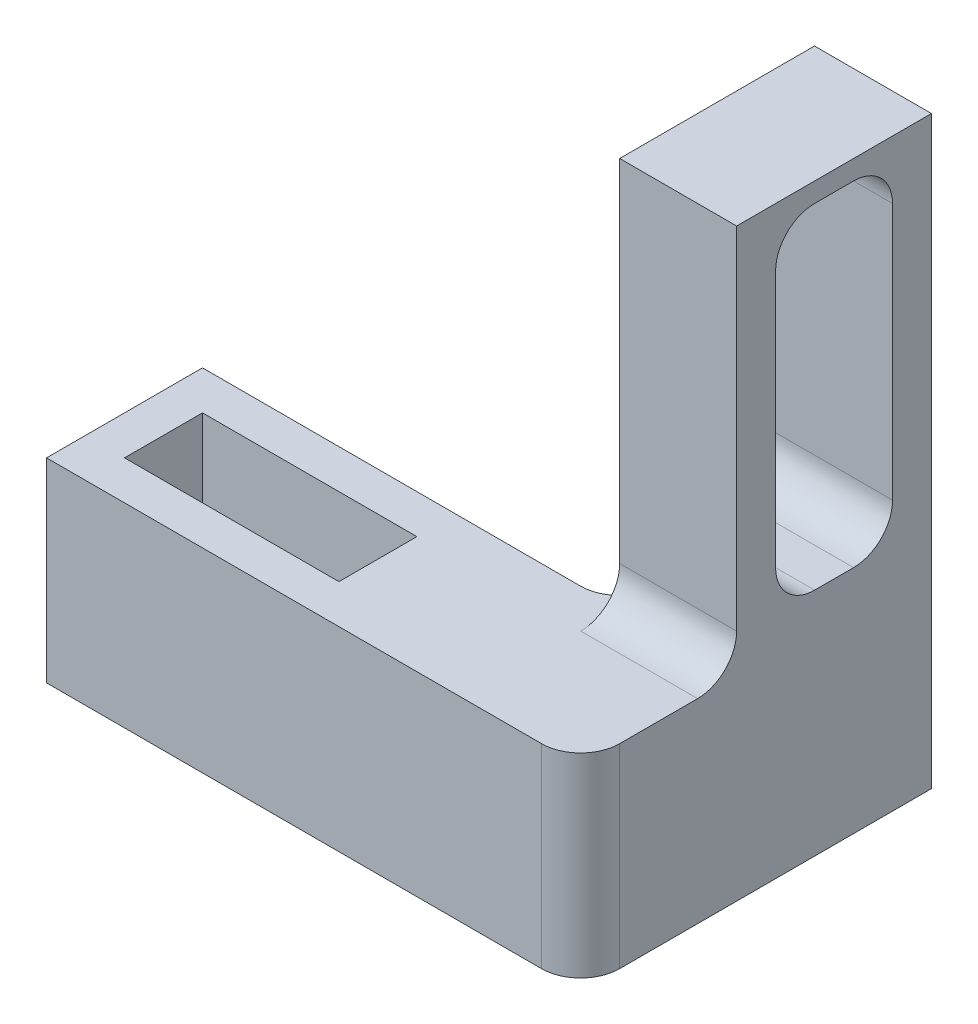
ISO-10303-21;
HEADER;
FILE_DESCRIPTION(('STEP AP214'),'2;1');
FILE_NAME('part.step','',(''),(''),'','','');
FILE_SCHEMA(('AUTOMOTIVE_DESIGN { 1 0 10303 214 1 1 1 1 }'));
ENDSEC;
DATA;
#1=APPLICATION_CONTEXT('core data for automotive mechanical design processes');
#2=APPLICATION_PROTOCOL_DEFINITION('international standard','automotive_design',2000,#1);
#3=PRODUCT_CONTEXT('',#1,'mechanical');
#4=PRODUCT('Part','Part','',(#3));
#5=PRODUCT_RELATED_PRODUCT_CATEGORY('part','',(#4));
#6=PRODUCT_DEFINITION_FORMATION('','',#4);
#7=PRODUCT_DEFINITION_CONTEXT('part definition',#1,'design');
#8=PRODUCT_DEFINITION('design','',#6,#7);
#9=PRODUCT_DEFINITION_SHAPE('','',#8);
#10=(LENGTH_UNIT() NAMED_UNIT(*) SI_UNIT(.MILLI.,.METRE.));
#11=(NAMED_UNIT(*) PLANE_ANGLE_UNIT() SI_UNIT($,.RADIAN.));
#12=(NAMED_UNIT(*) SI_UNIT($,.STERADIAN.) SOLID_ANGLE_UNIT());
#13=UNCERTAINTY_MEASURE_WITH_UNIT(LENGTH_MEASURE(1.E-05),#10,'distance_accuracy_value','');
#14=(GEOMETRIC_REPRESENTATION_CONTEXT(3) GLOBAL_UNCERTAINTY_ASSIGNED_CONTEXT((#13)) GLOBAL_UNIT_ASSIGNED_CONTEXT((#10,
#11,#12)) REPRESENTATION_CONTEXT('',''));
#15=CARTESIAN_POINT('',(0.,0.,0.));
#16=DIRECTION('',(0.,0.,1.));
#17=DIRECTION('',(1.,0.,0.));
#18=AXIS2_PLACEMENT_3D('',#15,#16,#17);
#19=CARTESIAN_POINT('',(-3.51352406652433,5.,-4.9069919410516));
#20=DIRECTION('',(0.,0.,1.));
#21=DIRECTION('',(1.,0.,0.));
#22=AXIS2_PLACEMENT_3D('',#19,#20,#21);
#23=PLANE('',#22);
#24=DIRECTION('',(0.,-1.,0.));
#25=VECTOR('',#24,1.);
#26=CARTESIAN_POINT('',(-3.51352406652433,5.,-4.9069919410516));
#27=LINE('',#26,#25);
#28=CARTESIAN_POINT('',(-3.51352406652433,5.,-4.9069919410516));
#29=VERTEX_POINT('',#28);
#30=CARTESIAN_POINT('',(-3.51352406652433,0.,-4.9069919410516));
#31=VERTEX_POINT('',#30);
#32=EDGE_CURVE('E270',#29,#31,#27,.T.);
#33=ORIENTED_EDGE('',*,*,#32,.F.);
#34=DIRECTION('',(1.,0.,0.));
#35=VECTOR('',#34,1.);
#36=CARTESIAN_POINT('',(-3.51352406652433,5.,-4.9069919410516));
#37=LINE('',#36,#35);
#38=CARTESIAN_POINT('',(6.18647593347567,5.,-4.9069919410516));
#39=VERTEX_POINT('',#38);
#40=EDGE_CURVE('E199',#29,#39,#37,.T.);
#41=ORIENTED_EDGE('',*,*,#40,.T.);
#42=DIRECTION('',(0.,1.,0.));
#43=VECTOR('',#42,1.);
#44=CARTESIAN_POINT('',(6.18647593347567,0.,-4.9069919410516));
#45=LINE('',#44,#43);
#46=CARTESIAN_POINT('',(6.18647593347567,0.,-4.9069919410516));
#47=VERTEX_POINT('',#46);
#48=EDGE_CURVE('E284',#39,#47,#45,.F.);
#49=ORIENTED_EDGE('',*,*,#48,.T.);
#50=DIRECTION('',(-1.,0.,0.));
#51=VECTOR('',#50,1.);
#52=CARTESIAN_POINT('',(-3.51352406652433,0.,-4.9069919410516));
#53=LINE('',#52,#51);
#54=EDGE_CURVE('E268',#47,#31,#53,.T.);
#55=ORIENTED_EDGE('',*,*,#54,.T.);
#56=EDGE_LOOP('',(#33,#41,#49,#55));
#57=FACE_BOUND('',#56,.T.);
#58=ADVANCED_FACE('F33',(#57),#23,.F.);
#59=CARTESIAN_POINT('',(0.,5.,0.));
#60=DIRECTION('',(0.,1.,0.));
#61=DIRECTION('',(0.,0.,1.));
#62=AXIS2_PLACEMENT_3D('',#59,#60,#61);
#63=PLANE('',#62);
#64=DIRECTION('',(1.,0.,0.));
#65=VECTOR('',#64,1.);
#66=CARTESIAN_POINT('',(-3.51352406652433,5.,-0.906991941051601));
#67=LINE('',#66,#65);
#68=CARTESIAN_POINT('',(-3.51352406652433,5.,-0.906991941051601));
#69=VERTEX_POINT('',#68);
#70=CARTESIAN_POINT('',(9.18647593347567,5.,-0.906991941051601));
#71=VERTEX_POINT('',#70);
#72=EDGE_CURVE('E267',#69,#71,#67,.T.);
#73=ORIENTED_EDGE('',*,*,#72,.T.);
#74=CARTESIAN_POINT('',(9.18647593347567,5.,-1.9069919410516));
#75=DIRECTION('',(0.,1.,0.));
#76=DIRECTION('',(0.,0.,1.));
#77=AXIS2_PLACEMENT_3D('',#74,#75,#76);
#78=CIRCLE('',#77,1.);
#79=CARTESIAN_POINT('',(10.1864759334757,5.,-1.9069919410516));
#80=VERTEX_POINT('',#79);
#81=EDGE_CURVE('E422',#71,#80,#78,.T.);
#82=ORIENTED_EDGE('',*,*,#81,.T.);
#83=DIRECTION('',(0.,0.,-1.));
#84=VECTOR('',#83,1.);
#85=CARTESIAN_POINT('',(10.1864759334757,5.,-0.906991941051601));
#86=LINE('',#85,#84);
#87=CARTESIAN_POINT('',(10.1864759334757,5.,-3.90941153273538));
#88=VERTEX_POINT('',#87);
#89=EDGE_CURVE('E214',#80,#88,#86,.T.);
#90=ORIENTED_EDGE('',*,*,#89,.T.);
#91=DIRECTION('',(1.,0.,0.));
#92=VECTOR('',#91,1.);
#93=CARTESIAN_POINT('',(0.,5.,-3.90941153273538));
#94=LINE('',#93,#92);
#95=CARTESIAN_POINT('',(7.18647593347567,5.,-3.90941153273538));
#96=VERTEX_POINT('',#95);
#97=EDGE_CURVE('E206',#88,#96,#94,.F.);
#98=ORIENTED_EDGE('',*,*,#97,.T.);
#99=DIRECTION('',(0.,0.,-1.));
#100=VECTOR('',#99,1.);
#101=CARTESIAN_POINT('',(7.18647593347567,5.,-5.9069919410516));
#102=LINE('',#101,#100);
#103=CARTESIAN_POINT('',(7.18647593347567,5.,-5.9069919410516));
#104=VERTEX_POINT('',#103);
#105=EDGE_CURVE('E187',#96,#104,#102,.T.);
#106=ORIENTED_EDGE('',*,*,#105,.T.);
#107=CARTESIAN_POINT('',(6.18647593347567,5.,-5.9069919410516));
#108=DIRECTION('',(0.,-1.,0.));
#109=DIRECTION('',(0.,0.,-1.));
#110=AXIS2_PLACEMENT_3D('',#107,#108,#109);
#111=CIRCLE('',#110,1.);
#112=EDGE_CURVE('E288',#39,#104,#111,.F.);
#113=ORIENTED_EDGE('',*,*,#112,.F.);
#114=ORIENTED_EDGE('',*,*,#40,.F.);
#115=DIRECTION('',(0.,0.,1.));
#116=VECTOR('',#115,1.);
#117=CARTESIAN_POINT('',(-3.51352406652433,5.,-4.9069919410516));
#118=LINE('',#117,#116);
#119=EDGE_CURVE('E265',#29,#69,#118,.T.);
#120=ORIENTED_EDGE('',*,*,#119,.T.);
#121=EDGE_LOOP('',(#73,#82,#90,#98,#106,#113,#114,#120));
#122=FACE_BOUND('',#121,.T.);
#123=DIRECTION('',(1.,0.,0.));
#124=VECTOR('',#123,1.);
#125=CARTESIAN_POINT('',(-2.51352406652433,5.,-1.9069919410516));
#126=LINE('',#125,#124);
#127=CARTESIAN_POINT('',(-2.51352406652433,5.,-1.9069919410516));
#128=VERTEX_POINT('',#127);
#129=CARTESIAN_POINT('',(2.98647593347567,5.,-1.9069919410516));
#130=VERTEX_POINT('',#129);
#131=EDGE_CURVE('E235',#128,#130,#126,.T.);
#132=ORIENTED_EDGE('',*,*,#131,.F.);
#133=DIRECTION('',(0.,0.,1.));
#134=VECTOR('',#133,1.);
#135=CARTESIAN_POINT('',(-2.51352406652433,5.,-3.9069919410516));
#136=LINE('',#135,#134);
#137=CARTESIAN_POINT('',(-2.51352406652433,5.,-3.9069919410516));
#138=VERTEX_POINT('',#137);
#139=EDGE_CURVE('E233',#138,#128,#136,.T.);
#140=ORIENTED_EDGE('',*,*,#139,.F.);
#141=DIRECTION('',(-1.,0.,0.));
#142=VECTOR('',#141,1.);
#143=CARTESIAN_POINT('',(-2.51352406652433,5.,-3.9069919410516));
#144=LINE('',#143,#142);
#145=CARTESIAN_POINT('',(2.98647593347567,5.,-3.9069919410516));
#146=VERTEX_POINT('',#145);
#147=EDGE_CURVE('E241',#146,#138,#144,.T.);
#148=ORIENTED_EDGE('',*,*,#147,.F.);
#149=DIRECTION('',(0.,0.,-1.));
#150=VECTOR('',#149,1.);
#151=CARTESIAN_POINT('',(2.98647593347567,5.,-3.9069919410516));
#152=LINE('',#151,#150);
#153=EDGE_CURVE('E238',#130,#146,#152,.T.);
#154=ORIENTED_EDGE('',*,*,#153,.F.);
#155=EDGE_LOOP('',(#132,#140,#148,#154));
#156=FACE_BOUND('',#155,.T.);
#157=ADVANCED_FACE('F211',(#122,#156),#63,.T.);
#158=CARTESIAN_POINT('',(0.,0.,0.));
#159=DIRECTION('',(0.,1.,0.));
#160=DIRECTION('',(0.,0.,1.));
#161=AXIS2_PLACEMENT_3D('',#158,#159,#160);
#162=PLANE('',#161);
#163=DIRECTION('',(0.,0.,-1.));
#164=VECTOR('',#163,1.);
#165=CARTESIAN_POINT('',(10.1864759334757,0.,-0.906991941051601));
#166=LINE('',#165,#164);
#167=CARTESIAN_POINT('',(10.1864759334757,0.,-1.9069919410516));
#168=VERTEX_POINT('',#167);
#169=CARTESIAN_POINT('',(10.1864759334757,0.,-9.9069919410516));
#170=VERTEX_POINT('',#169);
#171=EDGE_CURVE('E226',#168,#170,#166,.T.);
#172=ORIENTED_EDGE('',*,*,#171,.F.);
#173=CARTESIAN_POINT('',(9.18647593347567,0.,-1.9069919410516));
#174=DIRECTION('',(0.,1.,0.));
#175=DIRECTION('',(0.,0.,1.));
#176=AXIS2_PLACEMENT_3D('',#173,#174,#175);
#177=CIRCLE('',#176,1.);
#178=CARTESIAN_POINT('',(9.18647593347567,0.,-0.906991941051601));
#179=VERTEX_POINT('',#178);
#180=EDGE_CURVE('E427',#168,#179,#177,.F.);
#181=ORIENTED_EDGE('',*,*,#180,.T.);
#182=DIRECTION('',(1.,0.,0.));
#183=VECTOR('',#182,1.);
#184=CARTESIAN_POINT('',(-3.51352406652433,0.,-0.906991941051601));
#185=LINE('',#184,#183);
#186=CARTESIAN_POINT('',(-3.51352406652433,0.,-0.906991941051601));
#187=VERTEX_POINT('',#186);
#188=EDGE_CURVE('E273',#187,#179,#185,.T.);
#189=ORIENTED_EDGE('',*,*,#188,.F.);
#190=DIRECTION('',(0.,0.,1.));
#191=VECTOR('',#190,1.);
#192=CARTESIAN_POINT('',(-3.51352406652433,0.,-4.9069919410516));
#193=LINE('',#192,#191);
#194=EDGE_CURVE('E264',#31,#187,#193,.T.);
#195=ORIENTED_EDGE('',*,*,#194,.F.);
#196=ORIENTED_EDGE('',*,*,#54,.F.);
#197=CARTESIAN_POINT('',(6.18647593347567,0.,-5.9069919410516));
#198=DIRECTION('',(0.,1.,0.));
#199=DIRECTION('',(0.,0.,1.));
#200=AXIS2_PLACEMENT_3D('',#197,#198,#199);
#201=CIRCLE('',#200,1.);
#202=CARTESIAN_POINT('',(7.18647593347567,0.,-5.9069919410516));
#203=VERTEX_POINT('',#202);
#204=EDGE_CURVE('E286',#47,#203,#201,.T.);
#205=ORIENTED_EDGE('',*,*,#204,.T.);
#206=DIRECTION('',(0.,0.,1.));
#207=VECTOR('',#206,1.);
#208=CARTESIAN_POINT('',(7.18647593347567,0.,-9.9069919410516));
#209=LINE('',#208,#207);
#210=CARTESIAN_POINT('',(7.18647593347567,0.,-9.9069919410516));
#211=VERTEX_POINT('',#210);
#212=EDGE_CURVE('E227',#211,#203,#209,.T.);
#213=ORIENTED_EDGE('',*,*,#212,.F.);
#214=DIRECTION('',(-1.,0.,0.));
#215=VECTOR('',#214,1.);
#216=CARTESIAN_POINT('',(10.1864759334757,0.,-9.9069919410516));
#217=LINE('',#216,#215);
#218=EDGE_CURVE('E358',#170,#211,#217,.T.);
#219=ORIENTED_EDGE('',*,*,#218,.F.);
#220=EDGE_LOOP('',(#172,#181,#189,#195,#196,#205,#213,#219));
#221=FACE_BOUND('',#220,.T.);
#222=DIRECTION('',(0.,0.,1.));
#223=VECTOR('',#222,1.);
#224=CARTESIAN_POINT('',(-2.51352406652433,0.,-3.9069919410516));
#225=LINE('',#224,#223);
#226=CARTESIAN_POINT('',(-2.51352406652433,0.,-3.9069919410516));
#227=VERTEX_POINT('',#226);
#228=CARTESIAN_POINT('',(-2.51352406652433,0.,-1.9069919410516));
#229=VERTEX_POINT('',#228);
#230=EDGE_CURVE('E244',#227,#229,#225,.T.);
#231=ORIENTED_EDGE('',*,*,#230,.T.);
#232=DIRECTION('',(1.,0.,0.));
#233=VECTOR('',#232,1.);
#234=CARTESIAN_POINT('',(-2.51352406652433,0.,-1.9069919410516));
#235=LINE('',#234,#233);
#236=CARTESIAN_POINT('',(2.98647593347567,0.,-1.9069919410516));
#237=VERTEX_POINT('',#236);
#238=EDGE_CURVE('E247',#229,#237,#235,.T.);
#239=ORIENTED_EDGE('',*,*,#238,.T.);
#240=DIRECTION('',(0.,0.,-1.));
#241=VECTOR('',#240,1.);
#242=CARTESIAN_POINT('',(2.98647593347567,0.,-3.9069919410516));
#243=LINE('',#242,#241);
#244=CARTESIAN_POINT('',(2.98647593347567,0.,-3.9069919410516));
#245=VERTEX_POINT('',#244);
#246=EDGE_CURVE('E250',#237,#245,#243,.T.);
#247=ORIENTED_EDGE('',*,*,#246,.T.);
#248=DIRECTION('',(-1.,0.,0.));
#249=VECTOR('',#248,1.);
#250=CARTESIAN_POINT('',(-2.51352406652433,0.,-3.9069919410516));
#251=LINE('',#250,#249);
#252=EDGE_CURVE('E236',#245,#227,#251,.T.);
#253=ORIENTED_EDGE('',*,*,#252,.T.);
#254=EDGE_LOOP('',(#231,#239,#247,#253));
#255=FACE_BOUND('',#254,.T.);
#256=ADVANCED_FACE('F408',(#221,#255),#162,.F.);
#257=CARTESIAN_POINT('',(-3.51352406652433,5.,-4.9069919410516));
#258=DIRECTION('',(1.,0.,0.));
#259=DIRECTION('',(0.,0.,-1.));
#260=AXIS2_PLACEMENT_3D('',#257,#258,#259);
#261=PLANE('',#260);
#262=ORIENTED_EDGE('',*,*,#119,.F.);
#263=ORIENTED_EDGE('',*,*,#32,.T.);
#264=ORIENTED_EDGE('',*,*,#194,.T.);
#265=DIRECTION('',(0.,-1.,0.));
#266=VECTOR('',#265,1.);
#267=CARTESIAN_POINT('',(-3.51352406652433,5.,-0.906991941051601));
#268=LINE('',#267,#266);
#269=EDGE_CURVE('E366',#69,#187,#268,.T.);
#270=ORIENTED_EDGE('',*,*,#269,.F.);
#271=EDGE_LOOP('',(#262,#263,#264,#270));
#272=FACE_BOUND('',#271,.T.);
#273=ADVANCED_FACE('F415',(#272),#261,.F.);
#274=CARTESIAN_POINT('',(-3.51352406652433,5.,-0.906991941051601));
#275=DIRECTION('',(0.,0.,-1.));
#276=DIRECTION('',(-1.,0.,0.));
#277=AXIS2_PLACEMENT_3D('',#274,#275,#276);
#278=PLANE('',#277);
#279=ORIENTED_EDGE('',*,*,#188,.T.);
#280=DIRECTION('',(0.,-1.,0.));
#281=VECTOR('',#280,1.);
#282=CARTESIAN_POINT('',(9.18647593347567,5.,-0.906991941051601));
#283=LINE('',#282,#281);
#284=EDGE_CURVE('E420',#179,#71,#283,.F.);
#285=ORIENTED_EDGE('',*,*,#284,.T.);
#286=ORIENTED_EDGE('',*,*,#72,.F.);
#287=ORIENTED_EDGE('',*,*,#269,.T.);
#288=EDGE_LOOP('',(#279,#285,#286,#287));
#289=FACE_BOUND('',#288,.T.);
#290=ADVANCED_FACE('F418',(#289),#278,.F.);
#291=CARTESIAN_POINT('',(-2.51352406652433,5.,-3.9069919410516));
#292=DIRECTION('',(1.,0.,0.));
#293=DIRECTION('',(0.,0.,-1.));
#294=AXIS2_PLACEMENT_3D('',#291,#292,#293);
#295=PLANE('',#294);
#296=ORIENTED_EDGE('',*,*,#230,.F.);
#297=DIRECTION('',(0.,-1.,0.));
#298=VECTOR('',#297,1.);
#299=CARTESIAN_POINT('',(-2.51352406652433,5.,-3.9069919410516));
#300=LINE('',#299,#298);
#301=EDGE_CURVE('E243',#138,#227,#300,.T.);
#302=ORIENTED_EDGE('',*,*,#301,.F.);
#303=ORIENTED_EDGE('',*,*,#139,.T.);
#304=DIRECTION('',(0.,-1.,0.));
#305=VECTOR('',#304,1.);
#306=CARTESIAN_POINT('',(-2.51352406652433,5.,-1.9069919410516));
#307=LINE('',#306,#305);
#308=EDGE_CURVE('E261',#128,#229,#307,.T.);
#309=ORIENTED_EDGE('',*,*,#308,.T.);
#310=EDGE_LOOP('',(#296,#302,#303,#309));
#311=FACE_BOUND('',#310,.T.);
#312=ADVANCED_FACE('F456',(#311),#295,.T.);
#313=CARTESIAN_POINT('',(-2.51352406652433,5.,-1.9069919410516));
#314=DIRECTION('',(0.,0.,-1.));
#315=DIRECTION('',(-1.,0.,0.));
#316=AXIS2_PLACEMENT_3D('',#313,#314,#315);
#317=PLANE('',#316);
#318=ORIENTED_EDGE('',*,*,#238,.F.);
#319=ORIENTED_EDGE('',*,*,#308,.F.);
#320=ORIENTED_EDGE('',*,*,#131,.T.);
#321=DIRECTION('',(0.,-1.,0.));
#322=VECTOR('',#321,1.);
#323=CARTESIAN_POINT('',(2.98647593347567,5.,-1.9069919410516));
#324=LINE('',#323,#322);
#325=EDGE_CURVE('E259',#130,#237,#324,.T.);
#326=ORIENTED_EDGE('',*,*,#325,.T.);
#327=EDGE_LOOP('',(#318,#319,#320,#326));
#328=FACE_BOUND('',#327,.T.);
#329=ADVANCED_FACE('F604',(#328),#317,.T.);
#330=CARTESIAN_POINT('',(2.98647593347567,5.,-3.9069919410516));
#331=DIRECTION('',(-1.,0.,0.));
#332=DIRECTION('',(0.,0.,1.));
#333=AXIS2_PLACEMENT_3D('',#330,#331,#332);
#334=PLANE('',#333);
#335=ORIENTED_EDGE('',*,*,#246,.F.);
#336=ORIENTED_EDGE('',*,*,#325,.F.);
#337=ORIENTED_EDGE('',*,*,#153,.T.);
#338=DIRECTION('',(0.,-1.,0.));
#339=VECTOR('',#338,1.);
#340=CARTESIAN_POINT('',(2.98647593347567,5.,-3.9069919410516));
#341=LINE('',#340,#339);
#342=EDGE_CURVE('E257',#146,#245,#341,.T.);
#343=ORIENTED_EDGE('',*,*,#342,.T.);
#344=EDGE_LOOP('',(#335,#336,#337,#343));
#345=FACE_BOUND('',#344,.T.);
#346=ADVANCED_FACE('F612',(#345),#334,.T.);
#347=CARTESIAN_POINT('',(-2.51352406652433,5.,-3.9069919410516));
#348=DIRECTION('',(0.,0.,1.));
#349=DIRECTION('',(1.,0.,0.));
#350=AXIS2_PLACEMENT_3D('',#347,#348,#349);
#351=PLANE('',#350);
#352=ORIENTED_EDGE('',*,*,#252,.F.);
#353=ORIENTED_EDGE('',*,*,#342,.F.);
#354=ORIENTED_EDGE('',*,*,#147,.T.);
#355=ORIENTED_EDGE('',*,*,#301,.T.);
#356=EDGE_LOOP('',(#352,#353,#354,#355));
#357=FACE_BOUND('',#356,.T.);
#358=ADVANCED_FACE('F620',(#357),#351,.T.);
#359=CARTESIAN_POINT('',(10.1864759334757,5.,-0.906991941051601));
#360=DIRECTION('',(1.,0.,0.));
#361=DIRECTION('',(0.,0.,-1.));
#362=AXIS2_PLACEMENT_3D('',#359,#360,#361);
#363=PLANE('',#362);
#364=DIRECTION('',(0.,-1.,0.));
#365=VECTOR('',#364,1.);
#366=CARTESIAN_POINT('',(10.1864759334757,14.5,-5.90941153273538));
#367=LINE('',#366,#365);
#368=CARTESIAN_POINT('',(10.1864759334757,13.5,-5.90941153273538));
#369=VERTEX_POINT('',#368);
#370=CARTESIAN_POINT('',(10.1864759334757,6.91005895147456,-5.90941153273538));
#371=VERTEX_POINT('',#370);
#372=EDGE_CURVE('E386',#369,#371,#367,.T.);
#373=ORIENTED_EDGE('',*,*,#372,.F.);
#374=CARTESIAN_POINT('',(10.1864759334757,13.5,-6.90941153273538));
#375=DIRECTION('',(1.,0.,0.));
#376=DIRECTION('',(0.,0.,-1.));
#377=AXIS2_PLACEMENT_3D('',#374,#375,#376);
#378=CIRCLE('',#377,1.);
#379=CARTESIAN_POINT('',(10.1864759334757,14.5,-6.90941153273538));
#380=VERTEX_POINT('',#379);
#381=EDGE_CURVE('E318',#369,#380,#378,.F.);
#382=ORIENTED_EDGE('',*,*,#381,.T.);
#383=DIRECTION('',(0.,0.,1.));
#384=VECTOR('',#383,1.);
#385=CARTESIAN_POINT('',(10.1864759334757,14.5,-5.90941153273538));
#386=LINE('',#385,#384);
#387=CARTESIAN_POINT('',(10.1864759334757,14.5,-7.90941153273538));
#388=VERTEX_POINT('',#387);
#389=EDGE_CURVE('E330',#388,#380,#386,.T.);
#390=ORIENTED_EDGE('',*,*,#389,.F.);
#391=CARTESIAN_POINT('',(10.1864759334757,13.5,-7.90941153273538));
#392=DIRECTION('',(1.,0.,0.));
#393=DIRECTION('',(0.,0.,-1.));
#394=AXIS2_PLACEMENT_3D('',#391,#392,#393);
#395=CIRCLE('',#394,1.);
#396=CARTESIAN_POINT('',(10.1864759334757,13.5,-8.90941153273538));
#397=VERTEX_POINT('',#396);
#398=EDGE_CURVE('E41',#388,#397,#395,.F.);
#399=ORIENTED_EDGE('',*,*,#398,.T.);
#400=DIRECTION('',(0.,1.,0.));
#401=VECTOR('',#400,1.);
#402=CARTESIAN_POINT('',(10.1864759334757,14.5,-8.90941153273538));
#403=LINE('',#402,#401);
#404=CARTESIAN_POINT('',(10.1864759334757,6.91005895147456,-8.90941153273538));
#405=VERTEX_POINT('',#404);
#406=EDGE_CURVE('E339',#405,#397,#403,.T.);
#407=ORIENTED_EDGE('',*,*,#406,.F.);
#408=CARTESIAN_POINT('',(10.1864759334757,6.91005895147456,-7.90941153273538));
#409=DIRECTION('',(1.,0.,0.));
#410=DIRECTION('',(0.,0.,-1.));
#411=AXIS2_PLACEMENT_3D('',#408,#409,#410);
#412=CIRCLE('',#411,1.);
#413=CARTESIAN_POINT('',(10.1864759334757,5.91005895147456,-7.90941153273538));
#414=VERTEX_POINT('',#413);
#415=EDGE_CURVE('E296',#405,#414,#412,.F.);
#416=ORIENTED_EDGE('',*,*,#415,.T.);
#417=DIRECTION('',(0.,0.,-1.));
#418=VECTOR('',#417,1.);
#419=CARTESIAN_POINT('',(10.1864759334757,5.91005895147456,-5.90941153273538));
#420=LINE('',#419,#418);
#421=CARTESIAN_POINT('',(10.1864759334757,5.91005895147456,-6.90941153273538));
#422=VERTEX_POINT('',#421);
#423=EDGE_CURVE('E343',#422,#414,#420,.T.);
#424=ORIENTED_EDGE('',*,*,#423,.F.);
#425=CARTESIAN_POINT('',(10.1864759334757,6.91005895147456,-6.90941153273538));
#426=DIRECTION('',(1.,0.,0.));
#427=DIRECTION('',(0.,0.,-1.));
#428=AXIS2_PLACEMENT_3D('',#425,#426,#427);
#429=CIRCLE('',#428,1.);
#430=EDGE_CURVE('E307',#422,#371,#429,.F.);
#431=ORIENTED_EDGE('',*,*,#430,.T.);
#432=EDGE_LOOP('',(#373,#382,#390,#399,#407,#416,#424,#431));
#433=FACE_BOUND('',#432,.T.);
#434=ORIENTED_EDGE('',*,*,#89,.F.);
#435=DIRECTION('',(0.,-1.,0.));
#436=VECTOR('',#435,1.);
#437=CARTESIAN_POINT('',(10.1864759334757,0.,-1.9069919410516));
#438=LINE('',#437,#436);
#439=EDGE_CURVE('E218',#80,#168,#438,.T.);
#440=ORIENTED_EDGE('',*,*,#439,.T.);
#441=ORIENTED_EDGE('',*,*,#171,.T.);
#442=DIRECTION('',(0.,-1.,0.));
#443=VECTOR('',#442,1.);
#444=CARTESIAN_POINT('',(10.1864759334757,5.,-9.9069919410516));
#445=LINE('',#444,#443);
#446=CARTESIAN_POINT('',(10.1864759334757,15.,-9.9069919410516));
#447=VERTEX_POINT('',#446);
#448=EDGE_CURVE('E355',#447,#170,#445,.T.);
#449=ORIENTED_EDGE('',*,*,#448,.F.);
#450=DIRECTION('',(0.,0.,-1.));
#451=VECTOR('',#450,1.);
#452=CARTESIAN_POINT('',(10.1864759334757,15.,-9.9069919410516));
#453=LINE('',#452,#451);
#454=CARTESIAN_POINT('',(10.1864759334757,15.,-4.90941153273538));
#455=VERTEX_POINT('',#454);
#456=EDGE_CURVE('E348',#455,#447,#453,.T.);
#457=ORIENTED_EDGE('',*,*,#456,.F.);
#458=DIRECTION('',(0.,-1.,0.));
#459=VECTOR('',#458,1.);
#460=CARTESIAN_POINT('',(10.1864759334757,15.,-4.90941153273538));
#461=LINE('',#460,#459);
#462=CARTESIAN_POINT('',(10.1864759334757,6.,-4.90941153273538));
#463=VERTEX_POINT('',#462);
#464=EDGE_CURVE('E354',#455,#463,#461,.T.);
#465=ORIENTED_EDGE('',*,*,#464,.T.);
#466=CARTESIAN_POINT('',(10.1864759334757,6.,-3.90941153273538));
#467=DIRECTION('',(1.,0.,0.));
#468=DIRECTION('',(0.,0.,-1.));
#469=AXIS2_PLACEMENT_3D('',#466,#467,#468);
#470=CIRCLE('',#469,1.);
#471=EDGE_CURVE('E216',#463,#88,#470,.F.);
#472=ORIENTED_EDGE('',*,*,#471,.T.);
#473=EDGE_LOOP('',(#434,#440,#441,#449,#457,#465,#472));
#474=FACE_BOUND('',#473,.T.);
#475=ADVANCED_FACE('F335',(#433,#474),#363,.T.);
#476=CARTESIAN_POINT('',(7.18647593347567,5.,-9.9069919410516));
#477=DIRECTION('',(1.,0.,0.));
#478=DIRECTION('',(0.,1.,0.));
#479=AXIS2_PLACEMENT_3D('',#476,#477,#478);
#480=PLANE('',#479);
#481=DIRECTION('',(0.,1.,0.));
#482=VECTOR('',#481,1.);
#483=CARTESIAN_POINT('',(7.18647593347567,5.,-8.90941153273538));
#484=LINE('',#483,#482);
#485=CARTESIAN_POINT('',(7.18647593347567,6.91005895147456,-8.90941153273538));
#486=VERTEX_POINT('',#485);
#487=CARTESIAN_POINT('',(7.18647593347567,13.5,-8.90941153273538));
#488=VERTEX_POINT('',#487);
#489=EDGE_CURVE('E375',#486,#488,#484,.T.);
#490=ORIENTED_EDGE('',*,*,#489,.T.);
#491=CARTESIAN_POINT('',(7.18647593347567,13.5,-7.90941153273538));
#492=DIRECTION('',(1.,0.,0.));
#493=DIRECTION('',(0.,1.,0.));
#494=AXIS2_PLACEMENT_3D('',#491,#492,#493);
#495=CIRCLE('',#494,1.);
#496=CARTESIAN_POINT('',(7.18647593347567,14.5,-7.90941153273538));
#497=VERTEX_POINT('',#496);
#498=EDGE_CURVE('E11',#488,#497,#495,.T.);
#499=ORIENTED_EDGE('',*,*,#498,.T.);
#500=DIRECTION('',(0.,0.,1.));
#501=VECTOR('',#500,1.);
#502=CARTESIAN_POINT('',(7.18647593347567,14.5,-9.9069919410516));
#503=LINE('',#502,#501);
#504=CARTESIAN_POINT('',(7.18647593347567,14.5,-6.90941153273538));
#505=VERTEX_POINT('',#504);
#506=EDGE_CURVE('E331',#497,#505,#503,.T.);
#507=ORIENTED_EDGE('',*,*,#506,.T.);
#508=CARTESIAN_POINT('',(7.18647593347567,13.5,-6.90941153273538));
#509=DIRECTION('',(1.,0.,0.));
#510=DIRECTION('',(0.,1.,0.));
#511=AXIS2_PLACEMENT_3D('',#508,#509,#510);
#512=CIRCLE('',#511,1.);
#513=CARTESIAN_POINT('',(7.18647593347567,13.5,-5.90941153273538));
#514=VERTEX_POINT('',#513);
#515=EDGE_CURVE('E321',#505,#514,#512,.T.);
#516=ORIENTED_EDGE('',*,*,#515,.T.);
#517=DIRECTION('',(0.,-1.,0.));
#518=VECTOR('',#517,1.);
#519=CARTESIAN_POINT('',(7.18647593347567,5.,-5.90941153273538));
#520=LINE('',#519,#518);
#521=CARTESIAN_POINT('',(7.18647593347567,6.91005895147456,-5.90941153273538));
#522=VERTEX_POINT('',#521);
#523=EDGE_CURVE('E220',#514,#522,#520,.T.);
#524=ORIENTED_EDGE('',*,*,#523,.T.);
#525=CARTESIAN_POINT('',(7.18647593347567,6.91005895147456,-6.90941153273538));
#526=DIRECTION('',(1.,0.,0.));
#527=DIRECTION('',(0.,1.,0.));
#528=AXIS2_PLACEMENT_3D('',#525,#526,#527);
#529=CIRCLE('',#528,1.);
#530=CARTESIAN_POINT('',(7.18647593347567,5.91005895147456,-6.90941153273538));
#531=VERTEX_POINT('',#530);
#532=EDGE_CURVE('E310',#522,#531,#529,.T.);
#533=ORIENTED_EDGE('',*,*,#532,.T.);
#534=DIRECTION('',(0.,0.,-1.));
#535=VECTOR('',#534,1.);
#536=CARTESIAN_POINT('',(7.18647593347567,5.91005895147456,-9.9069919410516));
#537=LINE('',#536,#535);
#538=CARTESIAN_POINT('',(7.18647593347567,5.91005895147456,-7.90941153273538));
#539=VERTEX_POINT('',#538);
#540=EDGE_CURVE('E373',#531,#539,#537,.T.);
#541=ORIENTED_EDGE('',*,*,#540,.T.);
#542=CARTESIAN_POINT('',(7.18647593347567,6.91005895147456,-7.90941153273538));
#543=DIRECTION('',(1.,0.,0.));
#544=DIRECTION('',(0.,1.,0.));
#545=AXIS2_PLACEMENT_3D('',#542,#543,#544);
#546=CIRCLE('',#545,1.);
#547=EDGE_CURVE('E299',#539,#486,#546,.T.);
#548=ORIENTED_EDGE('',*,*,#547,.T.);
#549=EDGE_LOOP('',(#490,#499,#507,#516,#524,#533,#541,#548));
#550=FACE_BOUND('',#549,.T.);
#551=ORIENTED_EDGE('',*,*,#212,.T.);
#552=DIRECTION('',(0.,1.,0.));
#553=VECTOR('',#552,1.);
#554=CARTESIAN_POINT('',(7.18647593347567,5.93047785285145,-5.9069919410516));
#555=LINE('',#554,#553);
#556=EDGE_CURVE('E195',#203,#104,#555,.T.);
#557=ORIENTED_EDGE('',*,*,#556,.T.);
#558=ORIENTED_EDGE('',*,*,#105,.F.);
#559=CARTESIAN_POINT('',(7.18647593347567,6.,-3.90941153273538));
#560=DIRECTION('',(1.,0.,0.));
#561=DIRECTION('',(0.,0.,-1.));
#562=AXIS2_PLACEMENT_3D('',#559,#560,#561);
#563=CIRCLE('',#562,1.);
#564=CARTESIAN_POINT('',(7.18647593347567,6.,-4.90941153273538));
#565=VERTEX_POINT('',#564);
#566=EDGE_CURVE('E192',#565,#96,#563,.F.);
#567=ORIENTED_EDGE('',*,*,#566,.F.);
#568=DIRECTION('',(0.,-1.,0.));
#569=VECTOR('',#568,1.);
#570=CARTESIAN_POINT('',(7.18647593347567,15.,-4.90941153273538));
#571=LINE('',#570,#569);
#572=CARTESIAN_POINT('',(7.18647593347567,15.,-4.90941153273538));
#573=VERTEX_POINT('',#572);
#574=EDGE_CURVE('E208',#573,#565,#571,.T.);
#575=ORIENTED_EDGE('',*,*,#574,.F.);
#576=DIRECTION('',(0.,0.,1.));
#577=VECTOR('',#576,1.);
#578=CARTESIAN_POINT('',(7.18647593347567,15.,-9.9069919410516));
#579=LINE('',#578,#577);
#580=CARTESIAN_POINT('',(7.18647593347567,15.,-9.9069919410516));
#581=VERTEX_POINT('',#580);
#582=EDGE_CURVE('E338',#581,#573,#579,.T.);
#583=ORIENTED_EDGE('',*,*,#582,.F.);
#584=DIRECTION('',(0.,1.,0.));
#585=VECTOR('',#584,1.);
#586=CARTESIAN_POINT('',(7.18647593347567,5.,-9.9069919410516));
#587=LINE('',#586,#585);
#588=EDGE_CURVE('E359',#211,#581,#587,.T.);
#589=ORIENTED_EDGE('',*,*,#588,.F.);
#590=EDGE_LOOP('',(#551,#557,#558,#567,#575,#583,#589));
#591=FACE_BOUND('',#590,.T.);
#592=ADVANCED_FACE('F190',(#550,#591),#480,.F.);
#593=CARTESIAN_POINT('',(0.,0.,-9.9069919410516));
#594=DIRECTION('',(0.,0.,-1.));
#595=DIRECTION('',(-1.,0.,0.));
#596=AXIS2_PLACEMENT_3D('',#593,#594,#595);
#597=PLANE('',#596);
#598=ORIENTED_EDGE('',*,*,#448,.T.);
#599=ORIENTED_EDGE('',*,*,#218,.T.);
#600=ORIENTED_EDGE('',*,*,#588,.T.);
#601=DIRECTION('',(-1.,0.,0.));
#602=VECTOR('',#601,1.);
#603=CARTESIAN_POINT('',(7.18647593347567,15.,-9.9069919410516));
#604=LINE('',#603,#602);
#605=EDGE_CURVE('E351',#447,#581,#604,.T.);
#606=ORIENTED_EDGE('',*,*,#605,.F.);
#607=EDGE_LOOP('',(#598,#599,#600,#606));
#608=FACE_BOUND('',#607,.T.);
#609=ADVANCED_FACE('F429',(#608),#597,.T.);
#610=CARTESIAN_POINT('',(7.18647593347567,15.,-4.90941153273538));
#611=DIRECTION('',(0.,0.,-1.));
#612=DIRECTION('',(-1.,0.,0.));
#613=AXIS2_PLACEMENT_3D('',#610,#611,#612);
#614=PLANE('',#613);
#615=DIRECTION('',(1.,0.,0.));
#616=VECTOR('',#615,1.);
#617=CARTESIAN_POINT('',(7.18647593347567,15.,-4.90941153273538));
#618=LINE('',#617,#616);
#619=EDGE_CURVE('E341',#573,#455,#618,.T.);
#620=ORIENTED_EDGE('',*,*,#619,.F.);
#621=ORIENTED_EDGE('',*,*,#574,.T.);
#622=DIRECTION('',(1.,0.,0.));
#623=VECTOR('',#622,1.);
#624=CARTESIAN_POINT('',(7.18647593347567,6.,-4.90941153273538));
#625=LINE('',#624,#623);
#626=EDGE_CURVE('E207',#565,#463,#625,.T.);
#627=ORIENTED_EDGE('',*,*,#626,.T.);
#628=ORIENTED_EDGE('',*,*,#464,.F.);
#629=EDGE_LOOP('',(#620,#621,#627,#628));
#630=FACE_BOUND('',#629,.T.);
#631=ADVANCED_FACE('F437',(#630),#614,.F.);
#632=CARTESIAN_POINT('',(0.,15.,0.));
#633=DIRECTION('',(0.,1.,0.));
#634=DIRECTION('',(0.,0.,1.));
#635=AXIS2_PLACEMENT_3D('',#632,#633,#634);
#636=PLANE('',#635);
#637=ORIENTED_EDGE('',*,*,#582,.T.);
#638=ORIENTED_EDGE('',*,*,#619,.T.);
#639=ORIENTED_EDGE('',*,*,#456,.T.);
#640=ORIENTED_EDGE('',*,*,#605,.T.);
#641=EDGE_LOOP('',(#637,#638,#639,#640));
#642=FACE_BOUND('',#641,.T.);
#643=ADVANCED_FACE('F432',(#642),#636,.T.);
#644=CARTESIAN_POINT('',(0.186475933475672,14.5,-5.90941153273538));
#645=DIRECTION('',(0.,0.,1.));
#646=DIRECTION('',(0.,-1.,0.));
#647=AXIS2_PLACEMENT_3D('',#644,#645,#646);
#648=PLANE('',#647);
#649=ORIENTED_EDGE('',*,*,#523,.F.);
#650=DIRECTION('',(1.,0.,0.));
#651=VECTOR('',#650,1.);
#652=CARTESIAN_POINT('',(10.1864759334757,13.5,-5.90941153273538));
#653=LINE('',#652,#651);
#654=EDGE_CURVE('E312',#514,#369,#653,.T.);
#655=ORIENTED_EDGE('',*,*,#654,.T.);
#656=ORIENTED_EDGE('',*,*,#372,.T.);
#657=DIRECTION('',(1.,0.,0.));
#658=VECTOR('',#657,1.);
#659=CARTESIAN_POINT('',(7.18647593347567,6.91005895147456,-5.90941153273538));
#660=LINE('',#659,#658);
#661=EDGE_CURVE('E304',#371,#522,#660,.F.);
#662=ORIENTED_EDGE('',*,*,#661,.T.);
#663=EDGE_LOOP('',(#649,#655,#656,#662));
#664=FACE_BOUND('',#663,.T.);
#665=ADVANCED_FACE('F385',(#664),#648,.F.);
#666=CARTESIAN_POINT('',(0.186475933475672,14.5,-5.90941153273538));
#667=DIRECTION('',(0.,1.,0.));
#668=DIRECTION('',(0.,0.,1.));
#669=AXIS2_PLACEMENT_3D('',#666,#667,#668);
#670=PLANE('',#669);
#671=ORIENTED_EDGE('',*,*,#506,.F.);
#672=DIRECTION('',(1.,0.,0.));
#673=VECTOR('',#672,1.);
#674=CARTESIAN_POINT('',(10.1864759334757,14.5,-7.90941153273538));
#675=LINE('',#674,#673);
#676=EDGE_CURVE('E323',#497,#388,#675,.T.);
#677=ORIENTED_EDGE('',*,*,#676,.T.);
#678=ORIENTED_EDGE('',*,*,#389,.T.);
#679=DIRECTION('',(1.,0.,0.));
#680=VECTOR('',#679,1.);
#681=CARTESIAN_POINT('',(7.18647593347567,14.5,-6.90941153273538));
#682=LINE('',#681,#680);
#683=EDGE_CURVE('E315',#380,#505,#682,.F.);
#684=ORIENTED_EDGE('',*,*,#683,.T.);
#685=EDGE_LOOP('',(#671,#677,#678,#684));
#686=FACE_BOUND('',#685,.T.);
#687=ADVANCED_FACE('F329',(#686),#670,.F.);
#688=CARTESIAN_POINT('',(0.186475933475672,14.5,-8.90941153273538));
#689=DIRECTION('',(0.,0.,-1.));
#690=DIRECTION('',(-1.,0.,0.));
#691=AXIS2_PLACEMENT_3D('',#688,#689,#690);
#692=PLANE('',#691);
#693=ORIENTED_EDGE('',*,*,#406,.T.);
#694=DIRECTION('',(1.,0.,0.));
#695=VECTOR('',#694,1.);
#696=CARTESIAN_POINT('',(7.18647593347567,13.5,-8.90941153273538));
#697=LINE('',#696,#695);
#698=EDGE_CURVE('E54',#397,#488,#697,.F.);
#699=ORIENTED_EDGE('',*,*,#698,.T.);
#700=ORIENTED_EDGE('',*,*,#489,.F.);
#701=DIRECTION('',(1.,0.,0.));
#702=VECTOR('',#701,1.);
#703=CARTESIAN_POINT('',(10.1864759334757,6.91005895147456,-8.90941153273538));
#704=LINE('',#703,#702);
#705=EDGE_CURVE('E290',#486,#405,#704,.T.);
#706=ORIENTED_EDGE('',*,*,#705,.T.);
#707=EDGE_LOOP('',(#693,#699,#700,#706));
#708=FACE_BOUND('',#707,.T.);
#709=ADVANCED_FACE('F480',(#708),#692,.F.);
#710=CARTESIAN_POINT('',(0.186475933475672,5.91005895147456,-5.90941153273538));
#711=DIRECTION('',(0.,-1.,0.));
#712=DIRECTION('',(0.,0.,-1.));
#713=AXIS2_PLACEMENT_3D('',#710,#711,#712);
#714=PLANE('',#713);
#715=ORIENTED_EDGE('',*,*,#540,.F.);
#716=DIRECTION('',(1.,0.,0.));
#717=VECTOR('',#716,1.);
#718=CARTESIAN_POINT('',(10.1864759334757,5.91005895147456,-6.90941153273538));
#719=LINE('',#718,#717);
#720=EDGE_CURVE('E301',#531,#422,#719,.T.);
#721=ORIENTED_EDGE('',*,*,#720,.T.);
#722=ORIENTED_EDGE('',*,*,#423,.T.);
#723=DIRECTION('',(1.,0.,0.));
#724=VECTOR('',#723,1.);
#725=CARTESIAN_POINT('',(7.18647593347567,5.91005895147456,-7.90941153273538));
#726=LINE('',#725,#724);
#727=EDGE_CURVE('E293',#414,#539,#726,.F.);
#728=ORIENTED_EDGE('',*,*,#727,.T.);
#729=EDGE_LOOP('',(#715,#721,#722,#728));
#730=FACE_BOUND('',#729,.T.);
#731=ADVANCED_FACE('F392',(#730),#714,.F.);
#732=CARTESIAN_POINT('',(7.18647593347567,6.,-3.90941153273538));
#733=DIRECTION('',(1.,0.,0.));
#734=DIRECTION('',(0.,0.,-1.));
#735=AXIS2_PLACEMENT_3D('',#732,#733,#734);
#736=CYLINDRICAL_SURFACE('',#735,1.);
#737=ORIENTED_EDGE('',*,*,#626,.F.);
#738=ORIENTED_EDGE('',*,*,#566,.T.);
#739=ORIENTED_EDGE('',*,*,#97,.F.);
#740=ORIENTED_EDGE('',*,*,#471,.F.);
#741=EDGE_LOOP('',(#737,#738,#739,#740));
#742=FACE_BOUND('',#741,.T.);
#743=ADVANCED_FACE('F204',(#742),#736,.F.);
#744=CARTESIAN_POINT('',(9.18647593347567,5.,-1.9069919410516));
#745=DIRECTION('',(0.,1.,0.));
#746=DIRECTION('',(0.,0.,1.));
#747=AXIS2_PLACEMENT_3D('',#744,#745,#746);
#748=CYLINDRICAL_SURFACE('',#747,1.);
#749=ORIENTED_EDGE('',*,*,#81,.F.);
#750=ORIENTED_EDGE('',*,*,#284,.F.);
#751=ORIENTED_EDGE('',*,*,#180,.F.);
#752=ORIENTED_EDGE('',*,*,#439,.F.);
#753=EDGE_LOOP('',(#749,#750,#751,#752));
#754=FACE_BOUND('',#753,.T.);
#755=ADVANCED_FACE('F425',(#754),#748,.T.);
#756=CARTESIAN_POINT('',(6.18647593347567,5.,-5.9069919410516));
#757=DIRECTION('',(0.,-1.,0.));
#758=DIRECTION('',(1.,0.,0.));
#759=AXIS2_PLACEMENT_3D('',#756,#757,#758);
#760=CYLINDRICAL_SURFACE('',#759,1.);
#761=ORIENTED_EDGE('',*,*,#48,.F.);
#762=ORIENTED_EDGE('',*,*,#112,.T.);
#763=ORIENTED_EDGE('',*,*,#556,.F.);
#764=ORIENTED_EDGE('',*,*,#204,.F.);
#765=EDGE_LOOP('',(#761,#762,#763,#764));
#766=FACE_BOUND('',#765,.T.);
#767=ADVANCED_FACE('F405',(#766),#760,.F.);
#768=CARTESIAN_POINT('',(0.186475933475672,6.91005895147456,-7.90941153273538));
#769=DIRECTION('',(-1.,0.,0.));
#770=DIRECTION('',(0.,0.,1.));
#771=AXIS2_PLACEMENT_3D('',#768,#769,#770);
#772=CYLINDRICAL_SURFACE('',#771,1.);
#773=ORIENTED_EDGE('',*,*,#547,.F.);
#774=ORIENTED_EDGE('',*,*,#727,.F.);
#775=ORIENTED_EDGE('',*,*,#415,.F.);
#776=ORIENTED_EDGE('',*,*,#705,.F.);
#777=EDGE_LOOP('',(#773,#774,#775,#776));
#778=FACE_BOUND('',#777,.T.);
#779=ADVANCED_FACE('F465',(#778),#772,.F.);
#780=CARTESIAN_POINT('',(0.186475933475672,6.91005895147456,-6.90941153273538));
#781=DIRECTION('',(-1.,0.,0.));
#782=DIRECTION('',(0.,0.,1.));
#783=AXIS2_PLACEMENT_3D('',#780,#781,#782);
#784=CYLINDRICAL_SURFACE('',#783,1.);
#785=ORIENTED_EDGE('',*,*,#532,.F.);
#786=ORIENTED_EDGE('',*,*,#661,.F.);
#787=ORIENTED_EDGE('',*,*,#430,.F.);
#788=ORIENTED_EDGE('',*,*,#720,.F.);
#789=EDGE_LOOP('',(#785,#786,#787,#788));
#790=FACE_BOUND('',#789,.T.);
#791=ADVANCED_FACE('F389',(#790),#784,.F.);
#792=CARTESIAN_POINT('',(0.186475933475672,13.5,-6.90941153273538));
#793=DIRECTION('',(-1.,0.,0.));
#794=DIRECTION('',(0.,0.,1.));
#795=AXIS2_PLACEMENT_3D('',#792,#793,#794);
#796=CYLINDRICAL_SURFACE('',#795,1.);
#797=ORIENTED_EDGE('',*,*,#515,.F.);
#798=ORIENTED_EDGE('',*,*,#683,.F.);
#799=ORIENTED_EDGE('',*,*,#381,.F.);
#800=ORIENTED_EDGE('',*,*,#654,.F.);
#801=EDGE_LOOP('',(#797,#798,#799,#800));
#802=FACE_BOUND('',#801,.T.);
#803=ADVANCED_FACE('F470',(#802),#796,.F.);
#804=CARTESIAN_POINT('',(0.186475933475672,13.5,-7.90941153273538));
#805=DIRECTION('',(-1.,0.,0.));
#806=DIRECTION('',(0.,0.,1.));
#807=AXIS2_PLACEMENT_3D('',#804,#805,#806);
#808=CYLINDRICAL_SURFACE('',#807,1.);
#809=ORIENTED_EDGE('',*,*,#498,.F.);
#810=ORIENTED_EDGE('',*,*,#698,.F.);
#811=ORIENTED_EDGE('',*,*,#398,.F.);
#812=ORIENTED_EDGE('',*,*,#676,.F.);
#813=EDGE_LOOP('',(#809,#810,#811,#812));
#814=FACE_BOUND('',#813,.T.);
#815=ADVANCED_FACE('F35',(#814),#808,.F.);
#816=CLOSED_SHELL('',(#58,#157,#256,#273,#290,#312,#329,#346,#358,#475,#592,#609,#631,#643,#665,
#687,#709,#731,#743,#755,#767,#779,#791,#803,#815));
#817=MANIFOLD_SOLID_BREP('B2',#816);
#818=ADVANCED_BREP_SHAPE_REPRESENTATION('',(#18,#817),#14);
#819=SHAPE_DEFINITION_REPRESENTATION(#9,#818);
ENDSEC;
END-ISO-10303-21;
